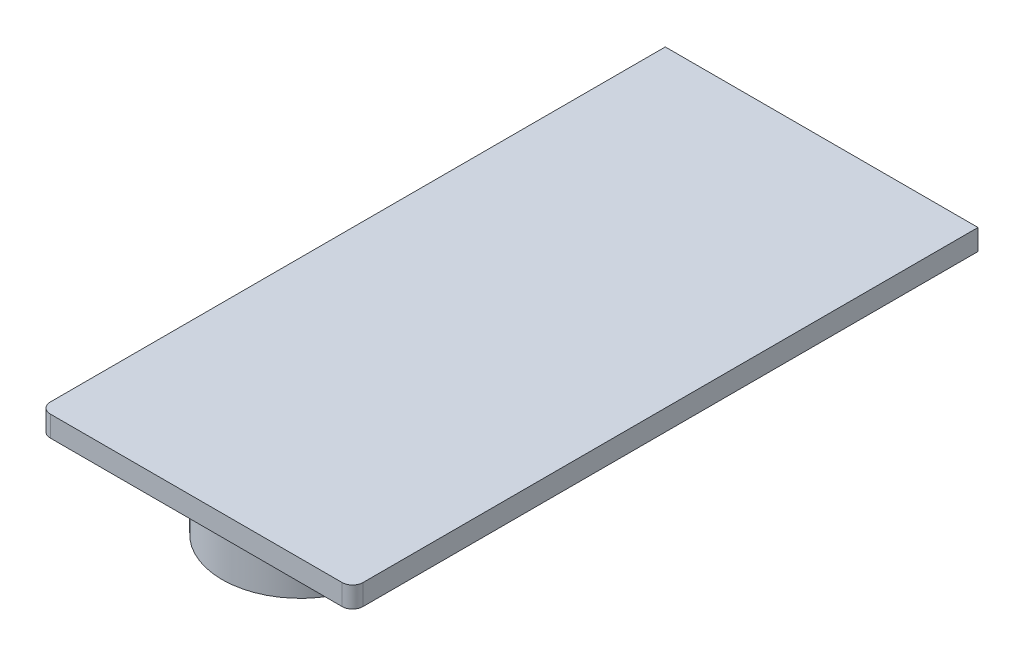
ISO-10303-21;
HEADER;
FILE_DESCRIPTION(('STEP AP214'),'2;1');
FILE_NAME('part.step','',(''),(''),'','','');
FILE_SCHEMA(('AUTOMOTIVE_DESIGN { 1 0 10303 214 1 1 1 1 }'));
ENDSEC;
DATA;
#1=APPLICATION_CONTEXT('core data for automotive mechanical design processes');
#2=APPLICATION_PROTOCOL_DEFINITION('international standard','automotive_design',2000,#1);
#3=PRODUCT_CONTEXT('',#1,'mechanical');
#4=PRODUCT('Part','Part','',(#3));
#5=PRODUCT_RELATED_PRODUCT_CATEGORY('part','',(#4));
#6=PRODUCT_DEFINITION_FORMATION('','',#4);
#7=PRODUCT_DEFINITION_CONTEXT('part definition',#1,'design');
#8=PRODUCT_DEFINITION('design','',#6,#7);
#9=PRODUCT_DEFINITION_SHAPE('','',#8);
#10=(LENGTH_UNIT() NAMED_UNIT(*) SI_UNIT(.MILLI.,.METRE.));
#11=(NAMED_UNIT(*) PLANE_ANGLE_UNIT() SI_UNIT($,.RADIAN.));
#12=(NAMED_UNIT(*) SI_UNIT($,.STERADIAN.) SOLID_ANGLE_UNIT());
#13=UNCERTAINTY_MEASURE_WITH_UNIT(LENGTH_MEASURE(1.E-05),#10,'distance_accuracy_value','');
#14=(GEOMETRIC_REPRESENTATION_CONTEXT(3) GLOBAL_UNCERTAINTY_ASSIGNED_CONTEXT((#13)) GLOBAL_UNIT_ASSIGNED_CONTEXT((#10,
#11,#12)) REPRESENTATION_CONTEXT('',''));
#15=CARTESIAN_POINT('',(0.,0.,0.));
#16=DIRECTION('',(0.,0.,1.));
#17=DIRECTION('',(1.,0.,0.));
#18=AXIS2_PLACEMENT_3D('',#15,#16,#17);
#19=CARTESIAN_POINT('',(38.1,2.54,-76.2));
#20=DIRECTION('',(1.,0.,0.));
#21=DIRECTION('',(0.,0.,-1.));
#22=AXIS2_PLACEMENT_3D('',#19,#20,#21);
#23=PLANE('',#22);
#24=DIRECTION('',(0.,0.,1.));
#25=VECTOR('',#24,1.);
#26=CARTESIAN_POINT('',(38.1,2.54,-76.2));
#27=LINE('',#26,#25);
#28=CARTESIAN_POINT('',(38.1,2.54,-76.2));
#29=VERTEX_POINT('',#28);
#30=CARTESIAN_POINT('',(38.1,2.54,-1.27000000000002));
#31=VERTEX_POINT('',#30);
#32=EDGE_CURVE('E111',#29,#31,#27,.T.);
#33=ORIENTED_EDGE('',*,*,#32,.T.);
#34=DIRECTION('',(0.,-1.,0.));
#35=VECTOR('',#34,1.);
#36=CARTESIAN_POINT('',(38.1,2.54,-1.26999999999999));
#37=LINE('',#36,#35);
#38=CARTESIAN_POINT('',(38.1,0.,-1.27000000000002));
#39=VERTEX_POINT('',#38);
#40=EDGE_CURVE('E47',#31,#39,#37,.T.);
#41=ORIENTED_EDGE('',*,*,#40,.T.);
#42=DIRECTION('',(0.,0.,1.));
#43=VECTOR('',#42,1.);
#44=CARTESIAN_POINT('',(38.1,0.,-76.2));
#45=LINE('',#44,#43);
#46=CARTESIAN_POINT('',(38.1,0.,-76.2));
#47=VERTEX_POINT('',#46);
#48=EDGE_CURVE('E115',#47,#39,#45,.T.);
#49=ORIENTED_EDGE('',*,*,#48,.F.);
#50=DIRECTION('',(0.,-1.,0.));
#51=VECTOR('',#50,1.);
#52=CARTESIAN_POINT('',(38.1,2.54,-76.2));
#53=LINE('',#52,#51);
#54=EDGE_CURVE('E108',#29,#47,#53,.T.);
#55=ORIENTED_EDGE('',*,*,#54,.F.);
#56=EDGE_LOOP('',(#33,#41,#49,#55));
#57=FACE_BOUND('',#56,.T.);
#58=ADVANCED_FACE('F39',(#57),#23,.T.);
#59=CARTESIAN_POINT('',(0.,2.54,-76.2));
#60=DIRECTION('',(0.,0.,-1.));
#61=DIRECTION('',(-1.,0.,0.));
#62=AXIS2_PLACEMENT_3D('',#59,#60,#61);
#63=PLANE('',#62);
#64=DIRECTION('',(1.,0.,0.));
#65=VECTOR('',#64,1.);
#66=CARTESIAN_POINT('',(0.,0.,-76.2));
#67=LINE('',#66,#65);
#68=CARTESIAN_POINT('',(0.,0.,-76.2));
#69=VERTEX_POINT('',#68);
#70=EDGE_CURVE('E107',#69,#47,#67,.T.);
#71=ORIENTED_EDGE('',*,*,#70,.F.);
#72=DIRECTION('',(0.,-1.,0.));
#73=VECTOR('',#72,1.);
#74=CARTESIAN_POINT('',(0.,2.54,-76.2));
#75=LINE('',#74,#73);
#76=CARTESIAN_POINT('',(0.,2.54,-76.2));
#77=VERTEX_POINT('',#76);
#78=EDGE_CURVE('E96',#77,#69,#75,.T.);
#79=ORIENTED_EDGE('',*,*,#78,.F.);
#80=DIRECTION('',(1.,0.,0.));
#81=VECTOR('',#80,1.);
#82=CARTESIAN_POINT('',(0.,2.54,-76.2));
#83=LINE('',#82,#81);
#84=EDGE_CURVE('E100',#77,#29,#83,.T.);
#85=ORIENTED_EDGE('',*,*,#84,.T.);
#86=ORIENTED_EDGE('',*,*,#54,.T.);
#87=EDGE_LOOP('',(#71,#79,#85,#86));
#88=FACE_BOUND('',#87,.T.);
#89=ADVANCED_FACE('F105',(#88),#63,.T.);
#90=CARTESIAN_POINT('',(0.,2.54,0.));
#91=DIRECTION('',(-1.,0.,0.));
#92=DIRECTION('',(0.,0.,1.));
#93=AXIS2_PLACEMENT_3D('',#90,#91,#92);
#94=PLANE('',#93);
#95=DIRECTION('',(0.,0.,-1.));
#96=VECTOR('',#95,1.);
#97=CARTESIAN_POINT('',(0.,0.,0.));
#98=LINE('',#97,#96);
#99=CARTESIAN_POINT('',(0.,0.,-1.27));
#100=VERTEX_POINT('',#99);
#101=EDGE_CURVE('E122',#100,#69,#98,.T.);
#102=ORIENTED_EDGE('',*,*,#101,.F.);
#103=DIRECTION('',(0.,-1.,0.));
#104=VECTOR('',#103,1.);
#105=CARTESIAN_POINT('',(0.,2.54,-1.27));
#106=LINE('',#105,#104);
#107=CARTESIAN_POINT('',(0.,2.54,-1.27));
#108=VERTEX_POINT('',#107);
#109=EDGE_CURVE('E62',#100,#108,#106,.F.);
#110=ORIENTED_EDGE('',*,*,#109,.T.);
#111=DIRECTION('',(0.,0.,-1.));
#112=VECTOR('',#111,1.);
#113=CARTESIAN_POINT('',(0.,2.54,0.));
#114=LINE('',#113,#112);
#115=EDGE_CURVE('E93',#108,#77,#114,.T.);
#116=ORIENTED_EDGE('',*,*,#115,.T.);
#117=ORIENTED_EDGE('',*,*,#78,.T.);
#118=EDGE_LOOP('',(#102,#110,#116,#117));
#119=FACE_BOUND('',#118,.T.);
#120=ADVANCED_FACE('F95',(#119),#94,.T.);
#121=CARTESIAN_POINT('',(38.1,2.54,0.));
#122=DIRECTION('',(0.,0.,1.));
#123=DIRECTION('',(1.,0.,0.));
#124=AXIS2_PLACEMENT_3D('',#121,#122,#123);
#125=PLANE('',#124);
#126=DIRECTION('',(-1.,0.,0.));
#127=VECTOR('',#126,1.);
#128=CARTESIAN_POINT('',(38.1,2.54,0.));
#129=LINE('',#128,#127);
#130=CARTESIAN_POINT('',(36.83,2.54,0.));
#131=VERTEX_POINT('',#130);
#132=CARTESIAN_POINT('',(1.27000000000001,2.54,0.));
#133=VERTEX_POINT('',#132);
#134=EDGE_CURVE('E101',#131,#133,#129,.T.);
#135=ORIENTED_EDGE('',*,*,#134,.T.);
#136=DIRECTION('',(0.,-1.,0.));
#137=VECTOR('',#136,1.);
#138=CARTESIAN_POINT('',(1.27,2.54,0.));
#139=LINE('',#138,#137);
#140=CARTESIAN_POINT('',(1.27000000000001,0.,0.));
#141=VERTEX_POINT('',#140);
#142=EDGE_CURVE('E128',#133,#141,#139,.T.);
#143=ORIENTED_EDGE('',*,*,#142,.T.);
#144=DIRECTION('',(-1.,0.,0.));
#145=VECTOR('',#144,1.);
#146=CARTESIAN_POINT('',(38.1,0.,0.));
#147=LINE('',#146,#145);
#148=CARTESIAN_POINT('',(36.83,0.,0.));
#149=VERTEX_POINT('',#148);
#150=EDGE_CURVE('E118',#149,#141,#147,.T.);
#151=ORIENTED_EDGE('',*,*,#150,.F.);
#152=DIRECTION('',(0.,-1.,0.));
#153=VECTOR('',#152,1.);
#154=CARTESIAN_POINT('',(36.83,2.54,0.));
#155=LINE('',#154,#153);
#156=EDGE_CURVE('E125',#149,#131,#155,.F.);
#157=ORIENTED_EDGE('',*,*,#156,.T.);
#158=EDGE_LOOP('',(#135,#143,#151,#157));
#159=FACE_BOUND('',#158,.T.);
#160=ADVANCED_FACE('F154',(#159),#125,.T.);
#161=CARTESIAN_POINT('',(0.,2.54,0.));
#162=DIRECTION('',(0.,-1.,0.));
#163=DIRECTION('',(0.,0.,-1.));
#164=AXIS2_PLACEMENT_3D('',#161,#162,#163);
#165=PLANE('',#164);
#166=ORIENTED_EDGE('',*,*,#115,.F.);
#167=CARTESIAN_POINT('',(1.27,2.54,-1.27));
#168=DIRECTION('',(0.,-1.,0.));
#169=DIRECTION('',(0.,0.,-1.));
#170=AXIS2_PLACEMENT_3D('',#167,#168,#169);
#171=CIRCLE('',#170,1.27);
#172=EDGE_CURVE('E140',#108,#133,#171,.F.);
#173=ORIENTED_EDGE('',*,*,#172,.T.);
#174=ORIENTED_EDGE('',*,*,#134,.F.);
#175=CARTESIAN_POINT('',(36.83,2.54,-1.26999999999999));
#176=DIRECTION('',(0.,-1.,0.));
#177=DIRECTION('',(0.,0.,-1.));
#178=AXIS2_PLACEMENT_3D('',#175,#176,#177);
#179=CIRCLE('',#178,1.27);
#180=EDGE_CURVE('E54',#131,#31,#179,.F.);
#181=ORIENTED_EDGE('',*,*,#180,.T.);
#182=ORIENTED_EDGE('',*,*,#32,.F.);
#183=ORIENTED_EDGE('',*,*,#84,.F.);
#184=EDGE_LOOP('',(#166,#173,#174,#181,#182,#183));
#185=FACE_BOUND('',#184,.T.);
#186=ADVANCED_FACE('F110',(#185),#165,.F.);
#187=CARTESIAN_POINT('',(0.,0.,0.));
#188=DIRECTION('',(0.,-1.,0.));
#189=DIRECTION('',(0.,0.,-1.));
#190=AXIS2_PLACEMENT_3D('',#187,#188,#189);
#191=PLANE('',#190);
#192=CARTESIAN_POINT('',(19.05,0.,-12.7));
#193=DIRECTION('',(0.,-1.,0.));
#194=DIRECTION('',(0.,0.,-1.));
#195=AXIS2_PLACEMENT_3D('',#192,#193,#194);
#196=CIRCLE('',#195,10.819995);
#197=CARTESIAN_POINT('',(19.05,0.,-23.519995));
#198=VERTEX_POINT('',#197);
#199=EDGE_CURVE('E131',#198,#198,#196,.F.);
#200=ORIENTED_EDGE('',*,*,#199,.T.);
#201=EDGE_LOOP('',(#200));
#202=FACE_BOUND('',#201,.T.);
#203=ORIENTED_EDGE('',*,*,#150,.T.);
#204=CARTESIAN_POINT('',(1.27,0.,-1.27));
#205=DIRECTION('',(0.,-1.,0.));
#206=DIRECTION('',(0.,0.,-1.));
#207=AXIS2_PLACEMENT_3D('',#204,#205,#206);
#208=CIRCLE('',#207,1.27);
#209=EDGE_CURVE('E136',#141,#100,#208,.T.);
#210=ORIENTED_EDGE('',*,*,#209,.T.);
#211=ORIENTED_EDGE('',*,*,#101,.T.);
#212=ORIENTED_EDGE('',*,*,#70,.T.);
#213=ORIENTED_EDGE('',*,*,#48,.T.);
#214=CARTESIAN_POINT('',(36.83,0.,-1.26999999999999));
#215=DIRECTION('',(0.,-1.,0.));
#216=DIRECTION('',(0.,0.,-1.));
#217=AXIS2_PLACEMENT_3D('',#214,#215,#216);
#218=CIRCLE('',#217,1.27);
#219=EDGE_CURVE('E134',#39,#149,#218,.T.);
#220=ORIENTED_EDGE('',*,*,#219,.T.);
#221=EDGE_LOOP('',(#203,#210,#211,#212,#213,#220));
#222=FACE_BOUND('',#221,.T.);
#223=ADVANCED_FACE('F147',(#202,#222),#191,.T.);
#224=CARTESIAN_POINT('',(19.05,-7.62,-12.7));
#225=DIRECTION('',(0.,1.,0.));
#226=DIRECTION('',(0.,0.,1.));
#227=AXIS2_PLACEMENT_3D('',#224,#225,#226);
#228=CYLINDRICAL_SURFACE('',#227,7.05);
#229=CARTESIAN_POINT('',(19.05,-7.62,-12.7));
#230=DIRECTION('',(0.,1.,0.));
#231=DIRECTION('',(0.,0.,1.));
#232=AXIS2_PLACEMENT_3D('',#229,#230,#231);
#233=CIRCLE('',#232,7.05);
#234=CARTESIAN_POINT('',(19.05,-7.62,-5.65));
#235=VERTEX_POINT('',#234);
#236=EDGE_CURVE('E161',#235,#235,#233,.T.);
#237=CARTESIAN_POINT('',(19.05,0.,-12.7));
#238=DIRECTION('',(0.,1.,0.));
#239=DIRECTION('',(0.,0.,1.));
#240=AXIS2_PLACEMENT_3D('',#237,#238,#239);
#241=CIRCLE('',#240,7.05);
#242=CARTESIAN_POINT('',(19.05,0.,-5.65));
#243=VERTEX_POINT('',#242);
#244=EDGE_CURVE('E158',#243,#243,#241,.T.);
#245=CARTESIAN_POINT('',(19.05,-7.62,-5.65));
#246=CARTESIAN_POINT('',(19.05,-7.540625,-5.65));
#247=CARTESIAN_POINT('',(19.05,-7.46125,-5.65));
#248=CARTESIAN_POINT('',(19.05,-7.3025,-5.65));
#249=CARTESIAN_POINT('',(19.05,-7.223125,-5.65));
#250=CARTESIAN_POINT('',(19.05,-7.064375,-5.65));
#251=CARTESIAN_POINT('',(19.05,-6.985,-5.65));
#252=CARTESIAN_POINT('',(19.05,-6.82625,-5.65));
#253=CARTESIAN_POINT('',(19.05,-6.746875,-5.65));
#254=CARTESIAN_POINT('',(19.05,-6.588125,-5.65));
#255=CARTESIAN_POINT('',(19.05,-6.50875,-5.65));
#256=CARTESIAN_POINT('',(19.05,-6.35,-5.65));
#257=CARTESIAN_POINT('',(19.05,-6.270625,-5.65));
#258=CARTESIAN_POINT('',(19.05,-6.111875,-5.65));
#259=CARTESIAN_POINT('',(19.05,-6.0325,-5.65));
#260=CARTESIAN_POINT('',(19.05,-5.87375,-5.65));
#261=CARTESIAN_POINT('',(19.05,-5.794375,-5.65));
#262=CARTESIAN_POINT('',(19.05,-5.635625,-5.65));
#263=CARTESIAN_POINT('',(19.05,-5.55625,-5.65));
#264=CARTESIAN_POINT('',(19.05,-5.3975,-5.65));
#265=CARTESIAN_POINT('',(19.05,-5.318125,-5.65));
#266=CARTESIAN_POINT('',(19.05,-5.159375,-5.65));
#267=CARTESIAN_POINT('',(19.05,-5.08,-5.65));
#268=CARTESIAN_POINT('',(19.05,-4.92125,-5.65));
#269=CARTESIAN_POINT('',(19.05,-4.841875,-5.65));
#270=CARTESIAN_POINT('',(19.05,-4.683125,-5.65));
#271=CARTESIAN_POINT('',(19.05,-4.60375,-5.65));
#272=CARTESIAN_POINT('',(19.05,-4.445,-5.65));
#273=CARTESIAN_POINT('',(19.05,-4.365625,-5.65));
#274=CARTESIAN_POINT('',(19.05,-4.206875,-5.65));
#275=CARTESIAN_POINT('',(19.05,-4.1275,-5.65));
#276=CARTESIAN_POINT('',(19.05,-3.96875,-5.65));
#277=CARTESIAN_POINT('',(19.05,-3.889375,-5.65));
#278=CARTESIAN_POINT('',(19.05,-3.730625,-5.65));
#279=CARTESIAN_POINT('',(19.05,-3.65125,-5.65));
#280=CARTESIAN_POINT('',(19.05,-3.4925,-5.65));
#281=CARTESIAN_POINT('',(19.05,-3.413125,-5.65));
#282=CARTESIAN_POINT('',(19.05,-3.254375,-5.65));
#283=CARTESIAN_POINT('',(19.05,-3.175,-5.65));
#284=CARTESIAN_POINT('',(19.05,-3.01625,-5.65));
#285=CARTESIAN_POINT('',(19.05,-2.936875,-5.65));
#286=CARTESIAN_POINT('',(19.05,-2.778125,-5.65));
#287=CARTESIAN_POINT('',(19.05,-2.69875,-5.65));
#288=CARTESIAN_POINT('',(19.05,-2.54,-5.65));
#289=CARTESIAN_POINT('',(19.05,-2.460625,-5.65));
#290=CARTESIAN_POINT('',(19.05,-2.301875,-5.65));
#291=CARTESIAN_POINT('',(19.05,-2.2225,-5.65));
#292=CARTESIAN_POINT('',(19.05,-2.06375,-5.65));
#293=CARTESIAN_POINT('',(19.05,-1.984375,-5.65));
#294=CARTESIAN_POINT('',(19.05,-1.825625,-5.65));
#295=CARTESIAN_POINT('',(19.05,-1.74625,-5.65));
#296=CARTESIAN_POINT('',(19.05,-1.5875,-5.65));
#297=CARTESIAN_POINT('',(19.05,-1.508125,-5.65));
#298=CARTESIAN_POINT('',(19.05,-1.349375,-5.65));
#299=CARTESIAN_POINT('',(19.05,-1.27,-5.65));
#300=CARTESIAN_POINT('',(19.05,-1.11125,-5.65));
#301=CARTESIAN_POINT('',(19.05,-1.031875,-5.65));
#302=CARTESIAN_POINT('',(19.05,-0.873125,-5.65));
#303=CARTESIAN_POINT('',(19.05,-0.79375,-5.65));
#304=CARTESIAN_POINT('',(19.05,-0.635,-5.65));
#305=CARTESIAN_POINT('',(19.05,-0.555625,-5.65));
#306=CARTESIAN_POINT('',(19.05,-0.396875,-5.65));
#307=CARTESIAN_POINT('',(19.05,-0.3175,-5.65));
#308=CARTESIAN_POINT('',(19.05,-0.15875,-5.65));
#309=CARTESIAN_POINT('',(19.05,-0.0793749999999999,-5.65));
#310=CARTESIAN_POINT('',(19.05,0.,-5.65));
#311=B_SPLINE_CURVE_WITH_KNOTS('',3,(#245,#246,#247,#248,#249,#250,#251,#252,#253,#254,#255,
#256,#257,#258,#259,#260,#261,#262,#263,#264,#265,#266,#267,#268,#269,#270,#271,#272,#273,#274,
#275,#276,#277,#278,#279,#280,#281,#282,#283,#284,#285,#286,#287,#288,#289,#290,#291,#292,#293,
#294,#295,#296,#297,#298,#299,#300,#301,#302,#303,#304,#305,#306,#307,#308,#309,#310),
.UNSPECIFIED.,.F.,.F.,(4,2,2,2,2,2,2,2,2,2,2,2,2,2,2,2,2,2,2,2,2,2,2,2,2,2,2,2,2,2,2,2,4),(0.,
0.238125,0.476249999999999,0.714375,0.952499999999999,1.190625,1.42875,1.666875,1.905,2.143125,
2.38125,2.619375,2.8575,3.095625,3.33375,3.571875,3.81,4.048125,4.28625,4.524375,4.7625,
5.000625,5.23875,5.476875,5.715,5.953125,6.19125,6.429375,6.6675,6.905625,7.14375,7.381875,
7.62),.UNSPECIFIED.);
#312=EDGE_CURVE('BSEAM170',#235,#243,#311,.T.);
#313=ORIENTED_EDGE('',*,*,#236,.F.);
#314=ORIENTED_EDGE('',*,*,#244,.T.);
#315=ORIENTED_EDGE('',*,*,#312,.T.);
#316=ORIENTED_EDGE('',*,*,#312,.F.);
#317=EDGE_LOOP('',(#313,#315,#314,#316));
#318=FACE_BOUND('',#317,.T.);
#319=ADVANCED_FACE('F170',(#318),#228,.F.);
#320=CARTESIAN_POINT('',(19.05,-7.62,-12.7));
#321=DIRECTION('',(0.,1.,0.));
#322=DIRECTION('',(0.,0.,1.));
#323=AXIS2_PLACEMENT_3D('',#320,#321,#322);
#324=CYLINDRICAL_SURFACE('',#323,9.549995);
#325=CARTESIAN_POINT('',(19.05,-1.27,-12.7));
#326=DIRECTION('',(0.,-1.,0.));
#327=DIRECTION('',(0.,0.,-1.));
#328=AXIS2_PLACEMENT_3D('',#325,#326,#327);
#329=CIRCLE('',#328,9.549995);
#330=CARTESIAN_POINT('',(19.05,-1.27,-3.150005));
#331=VERTEX_POINT('',#330);
#332=EDGE_CURVE('E11',#331,#331,#329,.T.);
#333=CARTESIAN_POINT('',(19.05,-7.62,-12.7));
#334=DIRECTION('',(0.,1.,0.));
#335=DIRECTION('',(0.,0.,1.));
#336=AXIS2_PLACEMENT_3D('',#333,#334,#335);
#337=CIRCLE('',#336,9.549995);
#338=CARTESIAN_POINT('',(19.05,-7.62,-3.150005));
#339=VERTEX_POINT('',#338);
#340=EDGE_CURVE('E119',#339,#339,#337,.T.);
#341=CARTESIAN_POINT('',(19.05,-1.27,-3.150005));
#342=CARTESIAN_POINT('',(19.05,-1.33614583333333,-3.150005));
#343=CARTESIAN_POINT('',(19.05,-1.40229166666667,-3.150005));
#344=CARTESIAN_POINT('',(19.05,-1.53458333333333,-3.150005));
#345=CARTESIAN_POINT('',(19.05,-1.60072916666667,-3.150005));
#346=CARTESIAN_POINT('',(19.05,-1.73302083333333,-3.150005));
#347=CARTESIAN_POINT('',(19.05,-1.79916666666667,-3.150005));
#348=CARTESIAN_POINT('',(19.05,-1.93145833333333,-3.150005));
#349=CARTESIAN_POINT('',(19.05,-1.99760416666667,-3.150005));
#350=CARTESIAN_POINT('',(19.05,-2.12989583333333,-3.150005));
#351=CARTESIAN_POINT('',(19.05,-2.19604166666667,-3.150005));
#352=CARTESIAN_POINT('',(19.05,-2.32833333333333,-3.150005));
#353=CARTESIAN_POINT('',(19.05,-2.39447916666667,-3.150005));
#354=CARTESIAN_POINT('',(19.05,-2.52677083333333,-3.150005));
#355=CARTESIAN_POINT('',(19.05,-2.59291666666667,-3.150005));
#356=CARTESIAN_POINT('',(19.05,-2.72520833333333,-3.150005));
#357=CARTESIAN_POINT('',(19.05,-2.79135416666667,-3.150005));
#358=CARTESIAN_POINT('',(19.05,-2.92364583333333,-3.150005));
#359=CARTESIAN_POINT('',(19.05,-2.98979166666667,-3.150005));
#360=CARTESIAN_POINT('',(19.05,-3.12208333333333,-3.150005));
#361=CARTESIAN_POINT('',(19.05,-3.18822916666667,-3.150005));
#362=CARTESIAN_POINT('',(19.05,-3.32052083333333,-3.150005));
#363=CARTESIAN_POINT('',(19.05,-3.38666666666667,-3.150005));
#364=CARTESIAN_POINT('',(19.05,-3.51895833333333,-3.150005));
#365=CARTESIAN_POINT('',(19.05,-3.58510416666667,-3.150005));
#366=CARTESIAN_POINT('',(19.05,-3.71739583333333,-3.150005));
#367=CARTESIAN_POINT('',(19.05,-3.78354166666667,-3.150005));
#368=CARTESIAN_POINT('',(19.05,-3.91583333333333,-3.150005));
#369=CARTESIAN_POINT('',(19.05,-3.98197916666667,-3.150005));
#370=CARTESIAN_POINT('',(19.05,-4.11427083333333,-3.150005));
#371=CARTESIAN_POINT('',(19.05,-4.18041666666667,-3.150005));
#372=CARTESIAN_POINT('',(19.05,-4.31270833333333,-3.150005));
#373=CARTESIAN_POINT('',(19.05,-4.37885416666667,-3.150005));
#374=CARTESIAN_POINT('',(19.05,-4.51114583333333,-3.150005));
#375=CARTESIAN_POINT('',(19.05,-4.57729166666667,-3.150005));
#376=CARTESIAN_POINT('',(19.05,-4.70958333333333,-3.150005));
#377=CARTESIAN_POINT('',(19.05,-4.77572916666667,-3.150005));
#378=CARTESIAN_POINT('',(19.05,-4.90802083333333,-3.150005));
#379=CARTESIAN_POINT('',(19.05,-4.97416666666667,-3.150005));
#380=CARTESIAN_POINT('',(19.05,-5.10645833333333,-3.150005));
#381=CARTESIAN_POINT('',(19.05,-5.17260416666667,-3.150005));
#382=CARTESIAN_POINT('',(19.05,-5.30489583333333,-3.150005));
#383=CARTESIAN_POINT('',(19.05,-5.37104166666667,-3.150005));
#384=CARTESIAN_POINT('',(19.05,-5.50333333333333,-3.150005));
#385=CARTESIAN_POINT('',(19.05,-5.56947916666667,-3.150005));
#386=CARTESIAN_POINT('',(19.05,-5.70177083333333,-3.150005));
#387=CARTESIAN_POINT('',(19.05,-5.76791666666667,-3.150005));
#388=CARTESIAN_POINT('',(19.05,-5.90020833333333,-3.150005));
#389=CARTESIAN_POINT('',(19.05,-5.96635416666667,-3.150005));
#390=CARTESIAN_POINT('',(19.05,-6.09864583333333,-3.150005));
#391=CARTESIAN_POINT('',(19.05,-6.16479166666667,-3.150005));
#392=CARTESIAN_POINT('',(19.05,-6.29708333333333,-3.150005));
#393=CARTESIAN_POINT('',(19.05,-6.36322916666667,-3.150005));
#394=CARTESIAN_POINT('',(19.05,-6.49552083333333,-3.150005));
#395=CARTESIAN_POINT('',(19.05,-6.56166666666667,-3.150005));
#396=CARTESIAN_POINT('',(19.05,-6.69395833333333,-3.150005));
#397=CARTESIAN_POINT('',(19.05,-6.76010416666667,-3.150005));
#398=CARTESIAN_POINT('',(19.05,-6.89239583333333,-3.150005));
#399=CARTESIAN_POINT('',(19.05,-6.95854166666667,-3.150005));
#400=CARTESIAN_POINT('',(19.05,-7.09083333333333,-3.150005));
#401=CARTESIAN_POINT('',(19.05,-7.15697916666667,-3.150005));
#402=CARTESIAN_POINT('',(19.05,-7.28927083333333,-3.150005));
#403=CARTESIAN_POINT('',(19.05,-7.35541666666667,-3.150005));
#404=CARTESIAN_POINT('',(19.05,-7.48770833333333,-3.150005));
#405=CARTESIAN_POINT('',(19.05,-7.55385416666667,-3.150005));
#406=CARTESIAN_POINT('',(19.05,-7.62,-3.150005));
#407=B_SPLINE_CURVE_WITH_KNOTS('',3,(#341,#342,#343,#344,#345,#346,#347,#348,#349,#350,#351,
#352,#353,#354,#355,#356,#357,#358,#359,#360,#361,#362,#363,#364,#365,#366,#367,#368,#369,#370,
#371,#372,#373,#374,#375,#376,#377,#378,#379,#380,#381,#382,#383,#384,#385,#386,#387,#388,#389,
#390,#391,#392,#393,#394,#395,#396,#397,#398,#399,#400,#401,#402,#403,#404,#405,#406),
.UNSPECIFIED.,.F.,.F.,(4,2,2,2,2,2,2,2,2,2,2,2,2,2,2,2,2,2,2,2,2,2,2,2,2,2,2,2,2,2,2,2,4),(0.,
0.1984375,0.396875,0.5953125,0.79375,0.9921875,1.190625,1.3890625,1.5875,1.7859375,1.984375,
2.1828125,2.38125,2.5796875,2.778125,2.9765625,3.175,3.3734375,3.571875,3.7703125,3.96875,
4.1671875,4.365625,4.5640625,4.7625,4.9609375,5.159375,5.3578125,5.55625,5.7546875,5.953125,
6.1515625,6.35),.UNSPECIFIED.);
#408=EDGE_CURVE('BSEAM173',#331,#339,#407,.T.);
#409=ORIENTED_EDGE('',*,*,#332,.T.);
#410=ORIENTED_EDGE('',*,*,#340,.T.);
#411=ORIENTED_EDGE('',*,*,#408,.T.);
#412=ORIENTED_EDGE('',*,*,#408,.F.);
#413=EDGE_LOOP('',(#409,#411,#410,#412));
#414=FACE_BOUND('',#413,.T.);
#415=ADVANCED_FACE('F173',(#414),#324,.T.);
#416=CARTESIAN_POINT('',(0.,-7.62,0.));
#417=DIRECTION('',(0.,1.,0.));
#418=DIRECTION('',(0.,0.,1.));
#419=AXIS2_PLACEMENT_3D('',#416,#417,#418);
#420=PLANE('',#419);
#421=ORIENTED_EDGE('',*,*,#236,.T.);
#422=EDGE_LOOP('',(#421));
#423=FACE_BOUND('',#422,.T.);
#424=ORIENTED_EDGE('',*,*,#340,.F.);
#425=EDGE_LOOP('',(#424));
#426=FACE_BOUND('',#425,.T.);
#427=ADVANCED_FACE('F167',(#423,#426),#420,.F.);
#428=ORIENTED_EDGE('',*,*,#244,.F.);
#429=EDGE_LOOP('',(#428));
#430=FACE_BOUND('',#429,.T.);
#431=ADVANCED_FACE('F177',(#430),#191,.T.);
#432=CARTESIAN_POINT('',(1.27,2.54,-1.27));
#433=DIRECTION('',(0.,-1.,0.));
#434=DIRECTION('',(0.,0.,-1.));
#435=AXIS2_PLACEMENT_3D('',#432,#433,#434);
#436=CYLINDRICAL_SURFACE('',#435,1.27);
#437=ORIENTED_EDGE('',*,*,#172,.F.);
#438=ORIENTED_EDGE('',*,*,#109,.F.);
#439=ORIENTED_EDGE('',*,*,#209,.F.);
#440=ORIENTED_EDGE('',*,*,#142,.F.);
#441=EDGE_LOOP('',(#437,#438,#439,#440));
#442=FACE_BOUND('',#441,.T.);
#443=ADVANCED_FACE('F150',(#442),#436,.T.);
#444=CARTESIAN_POINT('',(36.83,2.54,-1.26999999999999));
#445=DIRECTION('',(0.,-1.,0.));
#446=DIRECTION('',(0.,0.,-1.));
#447=AXIS2_PLACEMENT_3D('',#444,#445,#446);
#448=CYLINDRICAL_SURFACE('',#447,1.27);
#449=ORIENTED_EDGE('',*,*,#180,.F.);
#450=ORIENTED_EDGE('',*,*,#156,.F.);
#451=ORIENTED_EDGE('',*,*,#219,.F.);
#452=ORIENTED_EDGE('',*,*,#40,.F.);
#453=EDGE_LOOP('',(#449,#450,#451,#452));
#454=FACE_BOUND('',#453,.T.);
#455=ADVANCED_FACE('F184',(#454),#448,.T.);
#456=CARTESIAN_POINT('',(19.05,-1.27,-12.7));
#457=DIRECTION('',(0.,-1.,0.));
#458=DIRECTION('',(0.,0.,-1.));
#459=AXIS2_PLACEMENT_3D('',#456,#457,#458);
#460=TOROIDAL_SURFACE('',#459,10.819995,1.27);
#461=ORIENTED_EDGE('',*,*,#199,.F.);
#462=EDGE_LOOP('',(#461));
#463=FACE_BOUND('',#462,.T.);
#464=ORIENTED_EDGE('',*,*,#332,.F.);
#465=EDGE_LOOP('',(#464));
#466=FACE_BOUND('',#465,.T.);
#467=ADVANCED_FACE('F41',(#463,#466),#460,.F.);
#468=CLOSED_SHELL('',(#58,#89,#120,#160,#186,#223,#319,#415,#427,#431,#443,#455,#467));
#469=MANIFOLD_SOLID_BREP('B2',#468);
#470=ADVANCED_BREP_SHAPE_REPRESENTATION('',(#18,#469),#14);
#471=SHAPE_DEFINITION_REPRESENTATION(#9,#470);
ENDSEC;
END-ISO-10303-21;
